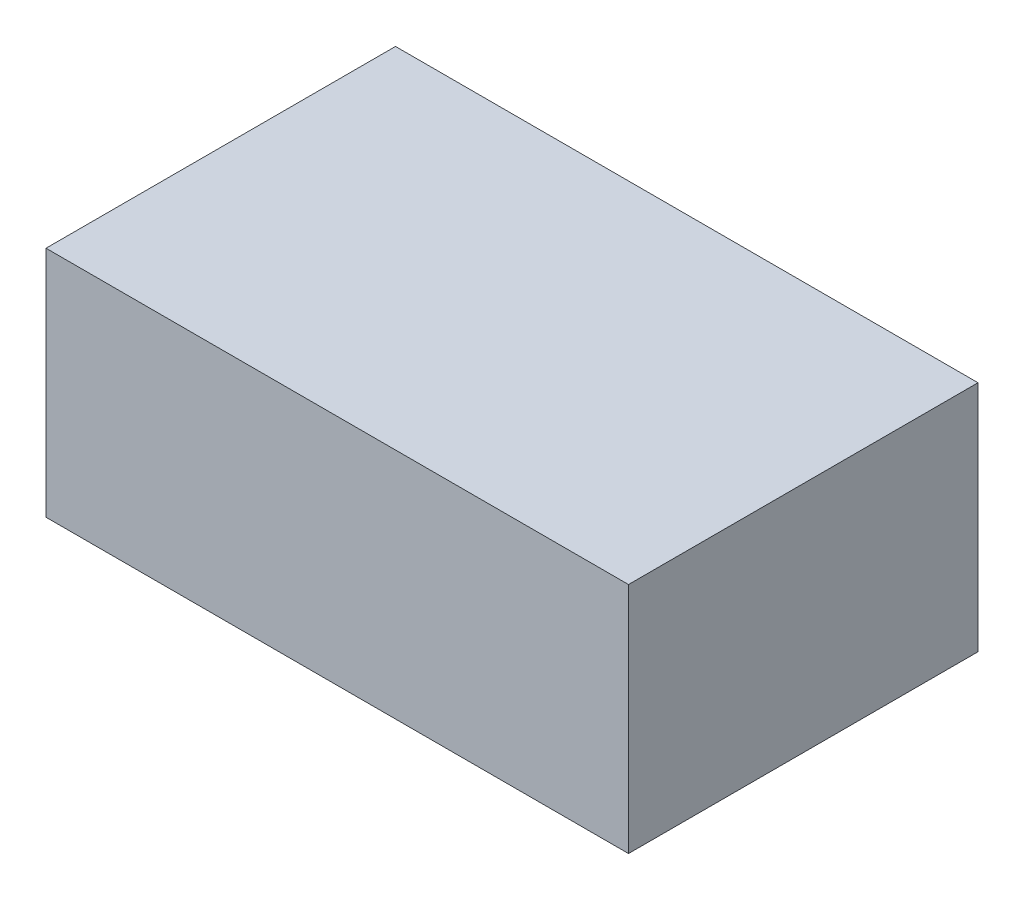
ISO-10303-21;
HEADER;
FILE_DESCRIPTION(('STEP AP214'),'2;1');
FILE_NAME('part.step','',(''),(''),'','','');
FILE_SCHEMA(('AUTOMOTIVE_DESIGN { 1 0 10303 214 1 1 1 1 }'));
ENDSEC;
DATA;
#1=APPLICATION_CONTEXT('core data for automotive mechanical design processes');
#2=APPLICATION_PROTOCOL_DEFINITION('international standard','automotive_design',2000,#1);
#3=PRODUCT_CONTEXT('',#1,'mechanical');
#4=PRODUCT('Part','Part','',(#3));
#5=PRODUCT_RELATED_PRODUCT_CATEGORY('part','',(#4));
#6=PRODUCT_DEFINITION_FORMATION('','',#4);
#7=PRODUCT_DEFINITION_CONTEXT('part definition',#1,'design');
#8=PRODUCT_DEFINITION('design','',#6,#7);
#9=PRODUCT_DEFINITION_SHAPE('','',#8);
#10=(LENGTH_UNIT() NAMED_UNIT(*) SI_UNIT(.MILLI.,.METRE.));
#11=(NAMED_UNIT(*) PLANE_ANGLE_UNIT() SI_UNIT($,.RADIAN.));
#12=(NAMED_UNIT(*) SI_UNIT($,.STERADIAN.) SOLID_ANGLE_UNIT());
#13=UNCERTAINTY_MEASURE_WITH_UNIT(LENGTH_MEASURE(1.E-05),#10,'distance_accuracy_value','');
#14=(GEOMETRIC_REPRESENTATION_CONTEXT(3) GLOBAL_UNCERTAINTY_ASSIGNED_CONTEXT((#13)) GLOBAL_UNIT_ASSIGNED_CONTEXT((#10,
#11,#12)) REPRESENTATION_CONTEXT('',''));
#15=CARTESIAN_POINT('',(0.,0.,0.));
#16=DIRECTION('',(0.,0.,1.));
#17=DIRECTION('',(1.,0.,0.));
#18=AXIS2_PLACEMENT_3D('',#15,#16,#17);
#19=CARTESIAN_POINT('',(-25.,20.,-30.));
#20=DIRECTION('',(1.,0.,0.));
#21=DIRECTION('',(0.,0.,-1.));
#22=AXIS2_PLACEMENT_3D('',#19,#20,#21);
#23=PLANE('',#22);
#24=DIRECTION('',(0.,0.,1.));
#25=VECTOR('',#24,1.);
#26=CARTESIAN_POINT('',(-25.,0.,-30.));
#27=LINE('',#26,#25);
#28=CARTESIAN_POINT('',(-25.,0.,-30.));
#29=VERTEX_POINT('',#28);
#30=CARTESIAN_POINT('',(-25.,0.,0.));
#31=VERTEX_POINT('',#30);
#32=EDGE_CURVE('E96',#29,#31,#27,.T.);
#33=ORIENTED_EDGE('',*,*,#32,.T.);
#34=DIRECTION('',(0.,-1.,0.));
#35=VECTOR('',#34,1.);
#36=CARTESIAN_POINT('',(-25.,20.,0.));
#37=LINE('',#36,#35);
#38=CARTESIAN_POINT('',(-25.,20.,0.));
#39=VERTEX_POINT('',#38);
#40=EDGE_CURVE('E11',#39,#31,#37,.T.);
#41=ORIENTED_EDGE('',*,*,#40,.F.);
#42=DIRECTION('',(0.,0.,1.));
#43=VECTOR('',#42,1.);
#44=CARTESIAN_POINT('',(-25.,20.,-30.));
#45=LINE('',#44,#43);
#46=CARTESIAN_POINT('',(-25.,20.,-30.));
#47=VERTEX_POINT('',#46);
#48=EDGE_CURVE('E84',#47,#39,#45,.T.);
#49=ORIENTED_EDGE('',*,*,#48,.F.);
#50=DIRECTION('',(0.,-1.,0.));
#51=VECTOR('',#50,1.);
#52=CARTESIAN_POINT('',(-25.,20.,-30.));
#53=LINE('',#52,#51);
#54=EDGE_CURVE('E92',#47,#29,#53,.T.);
#55=ORIENTED_EDGE('',*,*,#54,.T.);
#56=EDGE_LOOP('',(#33,#41,#49,#55));
#57=FACE_BOUND('',#56,.T.);
#58=ADVANCED_FACE('F33',(#57),#23,.F.);
#59=CARTESIAN_POINT('',(-25.,20.,0.));
#60=DIRECTION('',(0.,0.,-1.));
#61=DIRECTION('',(-1.,0.,0.));
#62=AXIS2_PLACEMENT_3D('',#59,#60,#61);
#63=PLANE('',#62);
#64=DIRECTION('',(1.,0.,0.));
#65=VECTOR('',#64,1.);
#66=CARTESIAN_POINT('',(-25.,0.,0.));
#67=LINE('',#66,#65);
#68=CARTESIAN_POINT('',(25.,0.,0.));
#69=VERTEX_POINT('',#68);
#70=EDGE_CURVE('E88',#31,#69,#67,.T.);
#71=ORIENTED_EDGE('',*,*,#70,.T.);
#72=DIRECTION('',(0.,-1.,0.));
#73=VECTOR('',#72,1.);
#74=CARTESIAN_POINT('',(25.,20.,0.));
#75=LINE('',#74,#73);
#76=CARTESIAN_POINT('',(25.,20.,0.));
#77=VERTEX_POINT('',#76);
#78=EDGE_CURVE('E41',#77,#69,#75,.T.);
#79=ORIENTED_EDGE('',*,*,#78,.F.);
#80=DIRECTION('',(1.,0.,0.));
#81=VECTOR('',#80,1.);
#82=CARTESIAN_POINT('',(-25.,20.,0.));
#83=LINE('',#82,#81);
#84=EDGE_CURVE('E79',#39,#77,#83,.T.);
#85=ORIENTED_EDGE('',*,*,#84,.F.);
#86=ORIENTED_EDGE('',*,*,#40,.T.);
#87=EDGE_LOOP('',(#71,#79,#85,#86));
#88=FACE_BOUND('',#87,.T.);
#89=ADVANCED_FACE('F87',(#88),#63,.F.);
#90=CARTESIAN_POINT('',(25.,20.,-30.));
#91=DIRECTION('',(-1.,0.,0.));
#92=DIRECTION('',(0.,0.,1.));
#93=AXIS2_PLACEMENT_3D('',#90,#91,#92);
#94=PLANE('',#93);
#95=DIRECTION('',(0.,0.,-1.));
#96=VECTOR('',#95,1.);
#97=CARTESIAN_POINT('',(25.,0.,-30.));
#98=LINE('',#97,#96);
#99=CARTESIAN_POINT('',(25.,0.,-30.));
#100=VERTEX_POINT('',#99);
#101=EDGE_CURVE('E66',#69,#100,#98,.T.);
#102=ORIENTED_EDGE('',*,*,#101,.T.);
#103=DIRECTION('',(0.,-1.,0.));
#104=VECTOR('',#103,1.);
#105=CARTESIAN_POINT('',(25.,20.,-30.));
#106=LINE('',#105,#104);
#107=CARTESIAN_POINT('',(25.,20.,-30.));
#108=VERTEX_POINT('',#107);
#109=EDGE_CURVE('E89',#108,#100,#106,.T.);
#110=ORIENTED_EDGE('',*,*,#109,.F.);
#111=DIRECTION('',(0.,0.,-1.));
#112=VECTOR('',#111,1.);
#113=CARTESIAN_POINT('',(25.,20.,-30.));
#114=LINE('',#113,#112);
#115=EDGE_CURVE('E82',#77,#108,#114,.T.);
#116=ORIENTED_EDGE('',*,*,#115,.F.);
#117=ORIENTED_EDGE('',*,*,#78,.T.);
#118=EDGE_LOOP('',(#102,#110,#116,#117));
#119=FACE_BOUND('',#118,.T.);
#120=ADVANCED_FACE('F90',(#119),#94,.F.);
#121=CARTESIAN_POINT('',(-25.,20.,-30.));
#122=DIRECTION('',(0.,0.,1.));
#123=DIRECTION('',(1.,0.,0.));
#124=AXIS2_PLACEMENT_3D('',#121,#122,#123);
#125=PLANE('',#124);
#126=DIRECTION('',(-1.,0.,0.));
#127=VECTOR('',#126,1.);
#128=CARTESIAN_POINT('',(-25.,0.,-30.));
#129=LINE('',#128,#127);
#130=EDGE_CURVE('E72',#100,#29,#129,.T.);
#131=ORIENTED_EDGE('',*,*,#130,.T.);
#132=ORIENTED_EDGE('',*,*,#54,.F.);
#133=DIRECTION('',(-1.,0.,0.));
#134=VECTOR('',#133,1.);
#135=CARTESIAN_POINT('',(-25.,20.,-30.));
#136=LINE('',#135,#134);
#137=EDGE_CURVE('E49',#108,#47,#136,.T.);
#138=ORIENTED_EDGE('',*,*,#137,.F.);
#139=ORIENTED_EDGE('',*,*,#109,.T.);
#140=EDGE_LOOP('',(#131,#132,#138,#139));
#141=FACE_BOUND('',#140,.T.);
#142=ADVANCED_FACE('F103',(#141),#125,.F.);
#143=CARTESIAN_POINT('',(0.,20.,0.));
#144=DIRECTION('',(0.,1.,0.));
#145=DIRECTION('',(0.,0.,1.));
#146=AXIS2_PLACEMENT_3D('',#143,#144,#145);
#147=PLANE('',#146);
#148=ORIENTED_EDGE('',*,*,#48,.T.);
#149=ORIENTED_EDGE('',*,*,#84,.T.);
#150=ORIENTED_EDGE('',*,*,#115,.T.);
#151=ORIENTED_EDGE('',*,*,#137,.T.);
#152=EDGE_LOOP('',(#148,#149,#150,#151));
#153=FACE_BOUND('',#152,.T.);
#154=ADVANCED_FACE('F80',(#153),#147,.T.);
#155=CARTESIAN_POINT('',(0.,0.,0.));
#156=DIRECTION('',(0.,1.,0.));
#157=DIRECTION('',(0.,0.,1.));
#158=AXIS2_PLACEMENT_3D('',#155,#156,#157);
#159=PLANE('',#158);
#160=ORIENTED_EDGE('',*,*,#32,.F.);
#161=ORIENTED_EDGE('',*,*,#130,.F.);
#162=ORIENTED_EDGE('',*,*,#101,.F.);
#163=ORIENTED_EDGE('',*,*,#70,.F.);
#164=EDGE_LOOP('',(#160,#161,#162,#163));
#165=FACE_BOUND('',#164,.T.);
#166=ADVANCED_FACE('F106',(#165),#159,.F.);
#167=CLOSED_SHELL('',(#58,#89,#120,#142,#154,#166));
#168=MANIFOLD_SOLID_BREP('B2',#167);
#169=ADVANCED_BREP_SHAPE_REPRESENTATION('',(#18,#168),#14);
#170=SHAPE_DEFINITION_REPRESENTATION(#9,#169);
ENDSEC;
END-ISO-10303-21;
